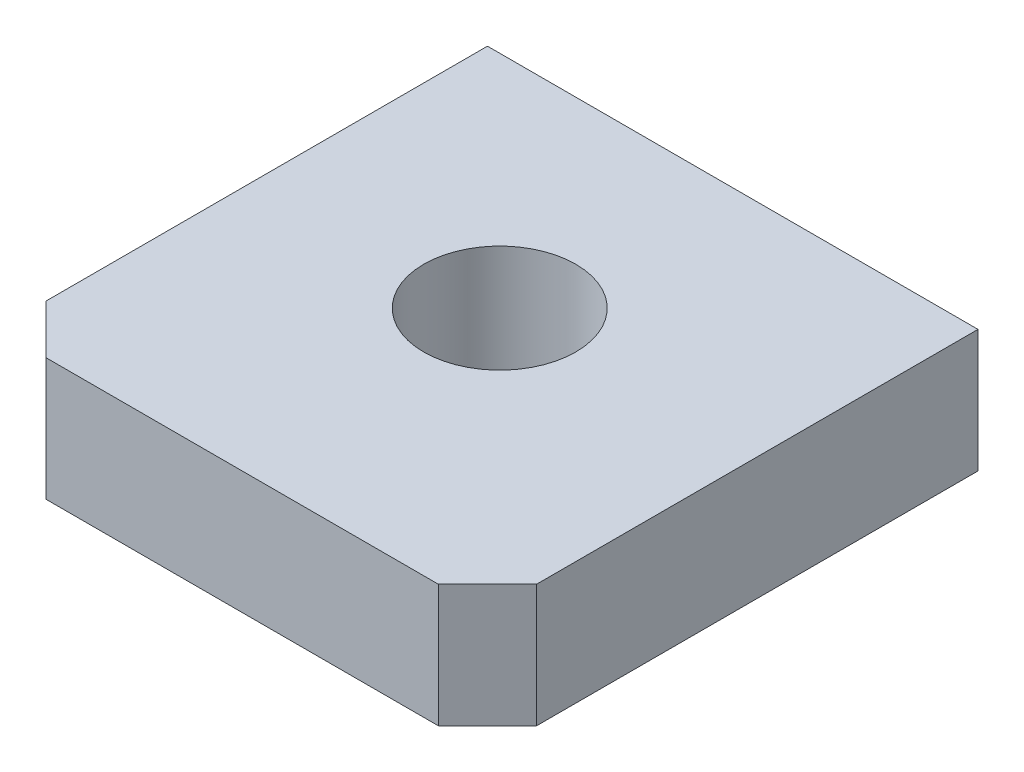
ISO-10303-21;
HEADER;
FILE_DESCRIPTION(('STEP AP214'),'2;1');
FILE_NAME('part.step','',(''),(''),'','','');
FILE_SCHEMA(('AUTOMOTIVE_DESIGN { 1 0 10303 214 1 1 1 1 }'));
ENDSEC;
DATA;
#1=APPLICATION_CONTEXT('core data for automotive mechanical design processes');
#2=APPLICATION_PROTOCOL_DEFINITION('international standard','automotive_design',2000,#1);
#3=PRODUCT_CONTEXT('',#1,'mechanical');
#4=PRODUCT('Part','Part','',(#3));
#5=PRODUCT_RELATED_PRODUCT_CATEGORY('part','',(#4));
#6=PRODUCT_DEFINITION_FORMATION('','',#4);
#7=PRODUCT_DEFINITION_CONTEXT('part definition',#1,'design');
#8=PRODUCT_DEFINITION('design','',#6,#7);
#9=PRODUCT_DEFINITION_SHAPE('','',#8);
#10=(LENGTH_UNIT() NAMED_UNIT(*) SI_UNIT(.MILLI.,.METRE.));
#11=(NAMED_UNIT(*) PLANE_ANGLE_UNIT() SI_UNIT($,.RADIAN.));
#12=(NAMED_UNIT(*) SI_UNIT($,.STERADIAN.) SOLID_ANGLE_UNIT());
#13=UNCERTAINTY_MEASURE_WITH_UNIT(LENGTH_MEASURE(1.E-05),#10,'distance_accuracy_value','');
#14=(GEOMETRIC_REPRESENTATION_CONTEXT(3) GLOBAL_UNCERTAINTY_ASSIGNED_CONTEXT((#13)) GLOBAL_UNIT_ASSIGNED_CONTEXT((#10,
#11,#12)) REPRESENTATION_CONTEXT('',''));
#15=CARTESIAN_POINT('',(0.,0.,0.));
#16=DIRECTION('',(0.,0.,1.));
#17=DIRECTION('',(1.,0.,0.));
#18=AXIS2_PLACEMENT_3D('',#15,#16,#17);
#19=CARTESIAN_POINT('',(0.,5.,0.));
#20=DIRECTION('',(1.,0.,0.));
#21=DIRECTION('',(0.,0.,-1.));
#22=AXIS2_PLACEMENT_3D('',#19,#20,#21);
#23=PLANE('',#22);
#24=DIRECTION('',(0.,0.,1.));
#25=VECTOR('',#24,1.);
#26=CARTESIAN_POINT('',(0.,0.,0.));
#27=LINE('',#26,#25);
#28=CARTESIAN_POINT('',(0.,0.,-20.));
#29=VERTEX_POINT('',#28);
#30=CARTESIAN_POINT('',(0.,0.,-2.00000000000001));
#31=VERTEX_POINT('',#30);
#32=EDGE_CURVE('E117',#29,#31,#27,.T.);
#33=ORIENTED_EDGE('',*,*,#32,.T.);
#34=DIRECTION('',(0.,1.,0.));
#35=VECTOR('',#34,1.);
#36=CARTESIAN_POINT('',(0.,5.,-2.00000000000001));
#37=LINE('',#36,#35);
#38=CARTESIAN_POINT('',(0.,5.,-2.00000000000001));
#39=VERTEX_POINT('',#38);
#40=EDGE_CURVE('E11',#31,#39,#37,.T.);
#41=ORIENTED_EDGE('',*,*,#40,.T.);
#42=DIRECTION('',(0.,0.,1.));
#43=VECTOR('',#42,1.);
#44=CARTESIAN_POINT('',(0.,5.,0.));
#45=LINE('',#44,#43);
#46=CARTESIAN_POINT('',(0.,5.,-20.));
#47=VERTEX_POINT('',#46);
#48=EDGE_CURVE('E124',#47,#39,#45,.T.);
#49=ORIENTED_EDGE('',*,*,#48,.F.);
#50=DIRECTION('',(0.,-1.,0.));
#51=VECTOR('',#50,1.);
#52=CARTESIAN_POINT('',(0.,5.,-20.));
#53=LINE('',#52,#51);
#54=EDGE_CURVE('E109',#47,#29,#53,.T.);
#55=ORIENTED_EDGE('',*,*,#54,.T.);
#56=EDGE_LOOP('',(#33,#41,#49,#55));
#57=FACE_BOUND('',#56,.T.);
#58=ADVANCED_FACE('F35',(#57),#23,.F.);
#59=CARTESIAN_POINT('',(0.,5.,0.));
#60=DIRECTION('',(0.,0.,-1.));
#61=DIRECTION('',(-1.,0.,0.));
#62=AXIS2_PLACEMENT_3D('',#59,#60,#61);
#63=PLANE('',#62);
#64=DIRECTION('',(1.,0.,0.));
#65=VECTOR('',#64,1.);
#66=CARTESIAN_POINT('',(0.,0.,0.));
#67=LINE('',#66,#65);
#68=CARTESIAN_POINT('',(2.,0.,0.));
#69=VERTEX_POINT('',#68);
#70=CARTESIAN_POINT('',(18.,0.,0.));
#71=VERTEX_POINT('',#70);
#72=EDGE_CURVE('E119',#69,#71,#67,.T.);
#73=ORIENTED_EDGE('',*,*,#72,.T.);
#74=DIRECTION('',(0.,1.,0.));
#75=VECTOR('',#74,1.);
#76=CARTESIAN_POINT('',(18.,5.,0.));
#77=LINE('',#76,#75);
#78=CARTESIAN_POINT('',(18.,5.,0.));
#79=VERTEX_POINT('',#78);
#80=EDGE_CURVE('E56',#71,#79,#77,.T.);
#81=ORIENTED_EDGE('',*,*,#80,.T.);
#82=DIRECTION('',(1.,0.,0.));
#83=VECTOR('',#82,1.);
#84=CARTESIAN_POINT('',(0.,5.,0.));
#85=LINE('',#84,#83);
#86=CARTESIAN_POINT('',(2.,5.,0.));
#87=VERTEX_POINT('',#86);
#88=EDGE_CURVE('E99',#87,#79,#85,.T.);
#89=ORIENTED_EDGE('',*,*,#88,.F.);
#90=DIRECTION('',(0.,-1.,0.));
#91=VECTOR('',#90,1.);
#92=CARTESIAN_POINT('',(2.,5.,0.));
#93=LINE('',#92,#91);
#94=EDGE_CURVE('E131',#87,#69,#93,.T.);
#95=ORIENTED_EDGE('',*,*,#94,.T.);
#96=EDGE_LOOP('',(#73,#81,#89,#95));
#97=FACE_BOUND('',#96,.T.);
#98=ADVANCED_FACE('F139',(#97),#63,.F.);
#99=CARTESIAN_POINT('',(20.,5.,0.));
#100=DIRECTION('',(-1.,0.,0.));
#101=DIRECTION('',(0.,0.,1.));
#102=AXIS2_PLACEMENT_3D('',#99,#100,#101);
#103=PLANE('',#102);
#104=DIRECTION('',(0.,0.,-1.));
#105=VECTOR('',#104,1.);
#106=CARTESIAN_POINT('',(20.,5.,0.));
#107=LINE('',#106,#105);
#108=CARTESIAN_POINT('',(20.,5.,-2.));
#109=VERTEX_POINT('',#108);
#110=CARTESIAN_POINT('',(20.,5.,-20.));
#111=VERTEX_POINT('',#110);
#112=EDGE_CURVE('E89',#109,#111,#107,.T.);
#113=ORIENTED_EDGE('',*,*,#112,.F.);
#114=DIRECTION('',(0.,-1.,0.));
#115=VECTOR('',#114,1.);
#116=CARTESIAN_POINT('',(20.,5.,-2.));
#117=LINE('',#116,#115);
#118=CARTESIAN_POINT('',(20.,0.,-2.00000000000001));
#119=VERTEX_POINT('',#118);
#120=EDGE_CURVE('E108',#109,#119,#117,.T.);
#121=ORIENTED_EDGE('',*,*,#120,.T.);
#122=DIRECTION('',(0.,0.,-1.));
#123=VECTOR('',#122,1.);
#124=CARTESIAN_POINT('',(20.,0.,0.));
#125=LINE('',#124,#123);
#126=CARTESIAN_POINT('',(20.,0.,-20.));
#127=VERTEX_POINT('',#126);
#128=EDGE_CURVE('E105',#119,#127,#125,.T.);
#129=ORIENTED_EDGE('',*,*,#128,.T.);
#130=DIRECTION('',(0.,-1.,0.));
#131=VECTOR('',#130,1.);
#132=CARTESIAN_POINT('',(20.,5.,-20.));
#133=LINE('',#132,#131);
#134=EDGE_CURVE('E102',#111,#127,#133,.T.);
#135=ORIENTED_EDGE('',*,*,#134,.F.);
#136=EDGE_LOOP('',(#113,#121,#129,#135));
#137=FACE_BOUND('',#136,.T.);
#138=ADVANCED_FACE('F103',(#137),#103,.F.);
#139=CARTESIAN_POINT('',(0.,5.,-20.));
#140=DIRECTION('',(0.,0.,1.));
#141=DIRECTION('',(1.,0.,0.));
#142=AXIS2_PLACEMENT_3D('',#139,#140,#141);
#143=PLANE('',#142);
#144=DIRECTION('',(-1.,0.,0.));
#145=VECTOR('',#144,1.);
#146=CARTESIAN_POINT('',(0.,0.,-20.));
#147=LINE('',#146,#145);
#148=EDGE_CURVE('E123',#127,#29,#147,.T.);
#149=ORIENTED_EDGE('',*,*,#148,.T.);
#150=ORIENTED_EDGE('',*,*,#54,.F.);
#151=DIRECTION('',(-1.,0.,0.));
#152=VECTOR('',#151,1.);
#153=CARTESIAN_POINT('',(0.,5.,-20.));
#154=LINE('',#153,#152);
#155=EDGE_CURVE('E93',#111,#47,#154,.T.);
#156=ORIENTED_EDGE('',*,*,#155,.F.);
#157=ORIENTED_EDGE('',*,*,#134,.T.);
#158=EDGE_LOOP('',(#149,#150,#156,#157));
#159=FACE_BOUND('',#158,.T.);
#160=ADVANCED_FACE('F111',(#159),#143,.F.);
#161=CARTESIAN_POINT('',(0.,5.,0.));
#162=DIRECTION('',(0.,-1.,0.));
#163=DIRECTION('',(0.,0.,-1.));
#164=AXIS2_PLACEMENT_3D('',#161,#162,#163);
#165=PLANE('',#164);
#166=CARTESIAN_POINT('',(9.5,5.,-11.));
#167=DIRECTION('',(0.,1.,0.));
#168=DIRECTION('',(0.,0.,1.));
#169=AXIS2_PLACEMENT_3D('',#166,#167,#168);
#170=CIRCLE('',#169,3.1);
#171=CARTESIAN_POINT('',(9.5,5.,-7.9));
#172=VERTEX_POINT('',#171);
#173=EDGE_CURVE('E146',#172,#172,#170,.T.);
#174=ORIENTED_EDGE('',*,*,#173,.F.);
#175=EDGE_LOOP('',(#174));
#176=FACE_BOUND('',#175,.T.);
#177=ORIENTED_EDGE('',*,*,#88,.T.);
#178=DIRECTION('',(-0.707106781186549,0.,0.707106781186546));
#179=VECTOR('',#178,1.);
#180=CARTESIAN_POINT('',(20.,5.,-2.));
#181=LINE('',#180,#179);
#182=EDGE_CURVE('E43',#79,#109,#181,.F.);
#183=ORIENTED_EDGE('',*,*,#182,.T.);
#184=ORIENTED_EDGE('',*,*,#112,.T.);
#185=ORIENTED_EDGE('',*,*,#155,.T.);
#186=ORIENTED_EDGE('',*,*,#48,.T.);
#187=DIRECTION('',(-0.707106781186546,0.,-0.707106781186549));
#188=VECTOR('',#187,1.);
#189=CARTESIAN_POINT('',(2.,5.,0.));
#190=LINE('',#189,#188);
#191=EDGE_CURVE('E135',#39,#87,#190,.F.);
#192=ORIENTED_EDGE('',*,*,#191,.T.);
#193=EDGE_LOOP('',(#177,#183,#184,#185,#186,#192));
#194=FACE_BOUND('',#193,.T.);
#195=ADVANCED_FACE('F91',(#176,#194),#165,.F.);
#196=CARTESIAN_POINT('',(0.,0.,0.));
#197=DIRECTION('',(0.,-1.,0.));
#198=DIRECTION('',(0.,0.,-1.));
#199=AXIS2_PLACEMENT_3D('',#196,#197,#198);
#200=PLANE('',#199);
#201=CARTESIAN_POINT('',(9.5,0.,-11.));
#202=DIRECTION('',(0.,1.,0.));
#203=DIRECTION('',(0.,0.,1.));
#204=AXIS2_PLACEMENT_3D('',#201,#202,#203);
#205=CIRCLE('',#204,3.1);
#206=CARTESIAN_POINT('',(9.5,0.,-7.9));
#207=VERTEX_POINT('',#206);
#208=EDGE_CURVE('E120',#207,#207,#205,.T.);
#209=ORIENTED_EDGE('',*,*,#208,.T.);
#210=EDGE_LOOP('',(#209));
#211=FACE_BOUND('',#210,.T.);
#212=ORIENTED_EDGE('',*,*,#128,.F.);
#213=DIRECTION('',(0.707106781186549,0.,-0.707106781186546));
#214=VECTOR('',#213,1.);
#215=CARTESIAN_POINT('',(8.99999999999996,0.,9.));
#216=LINE('',#215,#214);
#217=EDGE_CURVE('E129',#119,#71,#216,.F.);
#218=ORIENTED_EDGE('',*,*,#217,.T.);
#219=ORIENTED_EDGE('',*,*,#72,.F.);
#220=DIRECTION('',(0.707106781186546,0.,0.707106781186549));
#221=VECTOR('',#220,1.);
#222=CARTESIAN_POINT('',(1.,0.,-1.));
#223=LINE('',#222,#221);
#224=EDGE_CURVE('E127',#69,#31,#223,.F.);
#225=ORIENTED_EDGE('',*,*,#224,.T.);
#226=ORIENTED_EDGE('',*,*,#32,.F.);
#227=ORIENTED_EDGE('',*,*,#148,.F.);
#228=EDGE_LOOP('',(#212,#218,#219,#225,#226,#227));
#229=FACE_BOUND('',#228,.T.);
#230=ADVANCED_FACE('F143',(#211,#229),#200,.T.);
#231=CARTESIAN_POINT('',(9.5,0.,-11.));
#232=DIRECTION('',(0.,1.,0.));
#233=DIRECTION('',(0.,0.,1.));
#234=AXIS2_PLACEMENT_3D('',#231,#232,#233);
#235=CYLINDRICAL_SURFACE('',#234,3.1);
#236=ORIENTED_EDGE('',*,*,#208,.F.);
#237=EDGE_LOOP('',(#236));
#238=FACE_BOUND('',#237,.T.);
#239=ORIENTED_EDGE('',*,*,#173,.T.);
#240=EDGE_LOOP('',(#239));
#241=FACE_BOUND('',#240,.T.);
#242=ADVANCED_FACE('F153',(#238,#241),#235,.F.);
#243=CARTESIAN_POINT('',(20.,5.,-2.));
#244=DIRECTION('',(-0.707106781186546,0.,-0.707106781186549));
#245=DIRECTION('',(0.,-1.,0.));
#246=AXIS2_PLACEMENT_3D('',#243,#244,#245);
#247=PLANE('',#246);
#248=ORIENTED_EDGE('',*,*,#182,.F.);
#249=ORIENTED_EDGE('',*,*,#80,.F.);
#250=ORIENTED_EDGE('',*,*,#217,.F.);
#251=ORIENTED_EDGE('',*,*,#120,.F.);
#252=EDGE_LOOP('',(#248,#249,#250,#251));
#253=FACE_BOUND('',#252,.T.);
#254=ADVANCED_FACE('F156',(#253),#247,.F.);
#255=CARTESIAN_POINT('',(2.,5.,0.));
#256=DIRECTION('',(0.707106781186549,0.,-0.707106781186546));
#257=DIRECTION('',(0.,-1.,0.));
#258=AXIS2_PLACEMENT_3D('',#255,#256,#257);
#259=PLANE('',#258);
#260=ORIENTED_EDGE('',*,*,#191,.F.);
#261=ORIENTED_EDGE('',*,*,#40,.F.);
#262=ORIENTED_EDGE('',*,*,#224,.F.);
#263=ORIENTED_EDGE('',*,*,#94,.F.);
#264=EDGE_LOOP('',(#260,#261,#262,#263));
#265=FACE_BOUND('',#264,.T.);
#266=ADVANCED_FACE('F37',(#265),#259,.F.);
#267=CLOSED_SHELL('',(#58,#98,#138,#160,#195,#230,#242,#254,#266));
#268=MANIFOLD_SOLID_BREP('B2',#267);
#269=ADVANCED_BREP_SHAPE_REPRESENTATION('',(#18,#268),#14);
#270=SHAPE_DEFINITION_REPRESENTATION(#9,#269);
ENDSEC;
END-ISO-10303-21;
